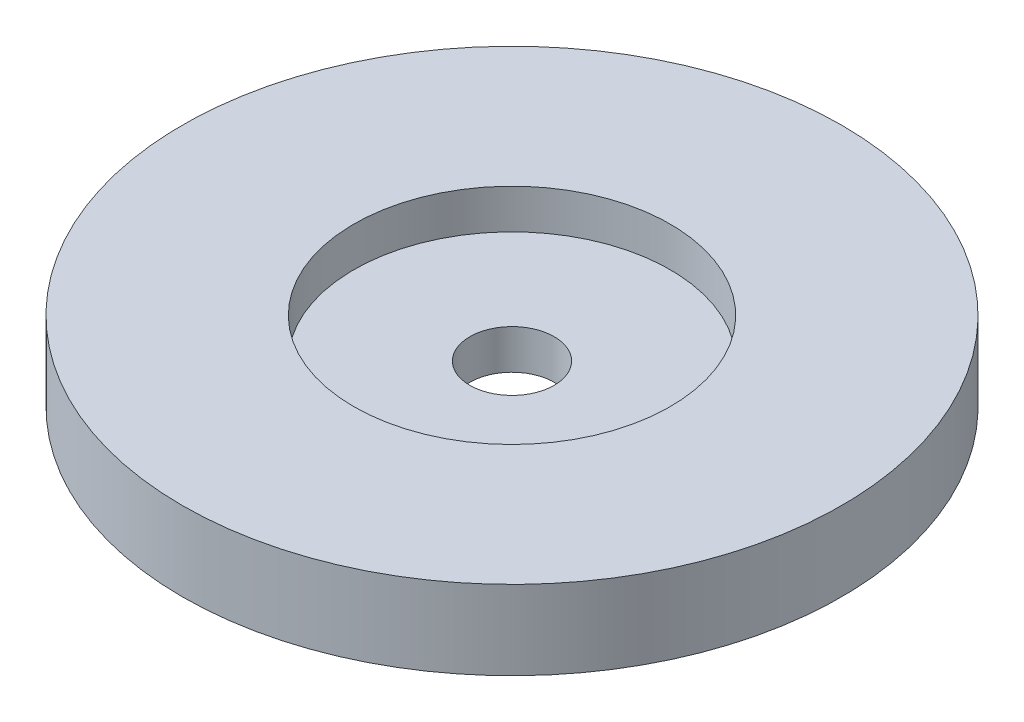
ISO-10303-21;
HEADER;
FILE_DESCRIPTION(('STEP AP214'),'2;1');
FILE_NAME('part.step','',(''),(''),'','','');
FILE_SCHEMA(('AUTOMOTIVE_DESIGN { 1 0 10303 214 1 1 1 1 }'));
ENDSEC;
DATA;
#1=APPLICATION_CONTEXT('core data for automotive mechanical design processes');
#2=APPLICATION_PROTOCOL_DEFINITION('international standard','automotive_design',2000,#1);
#3=PRODUCT_CONTEXT('',#1,'mechanical');
#4=PRODUCT('Part','Part','',(#3));
#5=PRODUCT_RELATED_PRODUCT_CATEGORY('part','',(#4));
#6=PRODUCT_DEFINITION_FORMATION('','',#4);
#7=PRODUCT_DEFINITION_CONTEXT('part definition',#1,'design');
#8=PRODUCT_DEFINITION('design','',#6,#7);
#9=PRODUCT_DEFINITION_SHAPE('','',#8);
#10=(LENGTH_UNIT() NAMED_UNIT(*) SI_UNIT(.MILLI.,.METRE.));
#11=(NAMED_UNIT(*) PLANE_ANGLE_UNIT() SI_UNIT($,.RADIAN.));
#12=(NAMED_UNIT(*) SI_UNIT($,.STERADIAN.) SOLID_ANGLE_UNIT());
#13=UNCERTAINTY_MEASURE_WITH_UNIT(LENGTH_MEASURE(1.E-05),#10,'distance_accuracy_value','');
#14=(GEOMETRIC_REPRESENTATION_CONTEXT(3) GLOBAL_UNCERTAINTY_ASSIGNED_CONTEXT((#13)) GLOBAL_UNIT_ASSIGNED_CONTEXT((#10,
#11,#12)) REPRESENTATION_CONTEXT('',''));
#15=CARTESIAN_POINT('',(0.,0.,0.));
#16=DIRECTION('',(0.,0.,1.));
#17=DIRECTION('',(1.,0.,0.));
#18=AXIS2_PLACEMENT_3D('',#15,#16,#17);
#19=CARTESIAN_POINT('',(0.,3.,0.));
#20=DIRECTION('',(0.,-1.,0.));
#21=DIRECTION('',(0.,0.,-1.));
#22=AXIS2_PLACEMENT_3D('',#19,#20,#21);
#23=CYLINDRICAL_SURFACE('',#22,12.5);
#24=CARTESIAN_POINT('',(0.,3.,0.));
#25=DIRECTION('',(0.,1.,0.));
#26=DIRECTION('',(0.,0.,1.));
#27=AXIS2_PLACEMENT_3D('',#24,#25,#26);
#28=CIRCLE('',#27,12.5);
#29=CARTESIAN_POINT('',(0.,3.,12.5));
#30=VERTEX_POINT('',#29);
#31=EDGE_CURVE('E10',#30,#30,#28,.T.);
#32=ORIENTED_EDGE('',*,*,#31,.F.);
#33=EDGE_LOOP('',(#32));
#34=FACE_BOUND('',#33,.T.);
#35=CARTESIAN_POINT('',(0.,0.,0.));
#36=DIRECTION('',(0.,1.,0.));
#37=DIRECTION('',(0.,0.,1.));
#38=AXIS2_PLACEMENT_3D('',#35,#36,#37);
#39=CIRCLE('',#38,12.5);
#40=CARTESIAN_POINT('',(0.,0.,12.5));
#41=VERTEX_POINT('',#40);
#42=EDGE_CURVE('E36',#41,#41,#39,.T.);
#43=ORIENTED_EDGE('',*,*,#42,.T.);
#44=EDGE_LOOP('',(#43));
#45=FACE_BOUND('',#44,.T.);
#46=ADVANCED_FACE('F33',(#34,#45),#23,.T.);
#47=CARTESIAN_POINT('',(0.,3.,0.));
#48=DIRECTION('',(0.,1.,0.));
#49=DIRECTION('',(0.,0.,1.));
#50=AXIS2_PLACEMENT_3D('',#47,#48,#49);
#51=PLANE('',#50);
#52=CARTESIAN_POINT('',(0.,3.,0.));
#53=DIRECTION('',(0.,1.,0.));
#54=DIRECTION('',(0.,0.,1.));
#55=AXIS2_PLACEMENT_3D('',#52,#53,#54);
#56=CIRCLE('',#55,6.);
#57=CARTESIAN_POINT('',(0.,3.,6.));
#58=VERTEX_POINT('',#57);
#59=EDGE_CURVE('E45',#58,#58,#56,.T.);
#60=ORIENTED_EDGE('',*,*,#59,.F.);
#61=EDGE_LOOP('',(#60));
#62=FACE_BOUND('',#61,.T.);
#63=ORIENTED_EDGE('',*,*,#31,.T.);
#64=EDGE_LOOP('',(#63));
#65=FACE_BOUND('',#64,.T.);
#66=ADVANCED_FACE('F78',(#62,#65),#51,.T.);
#67=CARTESIAN_POINT('',(0.,0.,0.));
#68=DIRECTION('',(0.,1.,0.));
#69=DIRECTION('',(0.,0.,1.));
#70=AXIS2_PLACEMENT_3D('',#67,#68,#69);
#71=PLANE('',#70);
#72=CARTESIAN_POINT('',(0.,0.,0.));
#73=DIRECTION('',(0.,1.,0.));
#74=DIRECTION('',(0.,0.,1.));
#75=AXIS2_PLACEMENT_3D('',#72,#73,#74);
#76=CIRCLE('',#75,1.6);
#77=CARTESIAN_POINT('',(0.,0.,1.6));
#78=VERTEX_POINT('',#77);
#79=EDGE_CURVE('E48',#78,#78,#76,.T.);
#80=ORIENTED_EDGE('',*,*,#79,.T.);
#81=EDGE_LOOP('',(#80));
#82=FACE_BOUND('',#81,.T.);
#83=ORIENTED_EDGE('',*,*,#42,.F.);
#84=EDGE_LOOP('',(#83));
#85=FACE_BOUND('',#84,.T.);
#86=ADVANCED_FACE('F57',(#82,#85),#71,.F.);
#87=CARTESIAN_POINT('',(0.,1.5,0.));
#88=DIRECTION('',(0.,1.,0.));
#89=DIRECTION('',(0.,0.,1.));
#90=AXIS2_PLACEMENT_3D('',#87,#88,#89);
#91=CYLINDRICAL_SURFACE('',#90,6.);
#92=CARTESIAN_POINT('',(0.,1.5,0.));
#93=DIRECTION('',(0.,1.,0.));
#94=DIRECTION('',(0.,0.,1.));
#95=AXIS2_PLACEMENT_3D('',#92,#93,#94);
#96=CIRCLE('',#95,6.);
#97=CARTESIAN_POINT('',(0.,1.5,6.));
#98=VERTEX_POINT('',#97);
#99=EDGE_CURVE('E43',#98,#98,#96,.T.);
#100=ORIENTED_EDGE('',*,*,#99,.F.);
#101=EDGE_LOOP('',(#100));
#102=FACE_BOUND('',#101,.T.);
#103=ORIENTED_EDGE('',*,*,#59,.T.);
#104=EDGE_LOOP('',(#103));
#105=FACE_BOUND('',#104,.T.);
#106=ADVANCED_FACE('F69',(#102,#105),#91,.F.);
#107=CARTESIAN_POINT('',(0.,1.5,0.));
#108=DIRECTION('',(0.,1.,0.));
#109=DIRECTION('',(0.,0.,1.));
#110=AXIS2_PLACEMENT_3D('',#107,#108,#109);
#111=PLANE('',#110);
#112=CARTESIAN_POINT('',(0.,1.5,0.));
#113=DIRECTION('',(0.,1.,0.));
#114=DIRECTION('',(0.,0.,1.));
#115=AXIS2_PLACEMENT_3D('',#112,#113,#114);
#116=CIRCLE('',#115,1.6);
#117=CARTESIAN_POINT('',(0.,1.5,1.6));
#118=VERTEX_POINT('',#117);
#119=EDGE_CURVE('E51',#118,#118,#116,.T.);
#120=ORIENTED_EDGE('',*,*,#119,.F.);
#121=EDGE_LOOP('',(#120));
#122=FACE_BOUND('',#121,.T.);
#123=ORIENTED_EDGE('',*,*,#99,.T.);
#124=EDGE_LOOP('',(#123));
#125=FACE_BOUND('',#124,.T.);
#126=ADVANCED_FACE('F63',(#122,#125),#111,.T.);
#127=CARTESIAN_POINT('',(0.,0.,0.));
#128=DIRECTION('',(0.,1.,0.));
#129=DIRECTION('',(0.,0.,1.));
#130=AXIS2_PLACEMENT_3D('',#127,#128,#129);
#131=CYLINDRICAL_SURFACE('',#130,1.6);
#132=ORIENTED_EDGE('',*,*,#79,.F.);
#133=EDGE_LOOP('',(#132));
#134=FACE_BOUND('',#133,.T.);
#135=ORIENTED_EDGE('',*,*,#119,.T.);
#136=EDGE_LOOP('',(#135));
#137=FACE_BOUND('',#136,.T.);
#138=ADVANCED_FACE('F60',(#134,#137),#131,.F.);
#139=CLOSED_SHELL('',(#46,#66,#86,#106,#126,#138));
#140=MANIFOLD_SOLID_BREP('B2',#139);
#141=ADVANCED_BREP_SHAPE_REPRESENTATION('',(#18,#140),#14);
#142=SHAPE_DEFINITION_REPRESENTATION(#9,#141);
ENDSEC;
END-ISO-10303-21;
